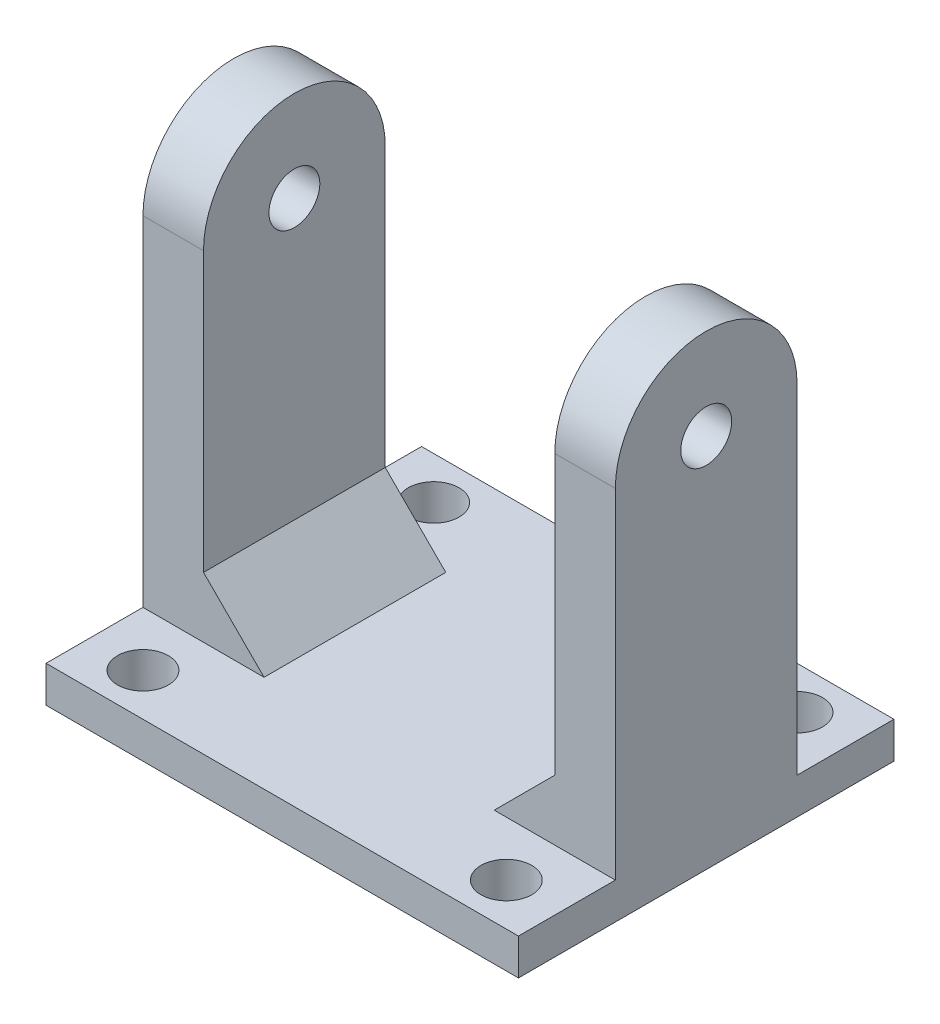
ISO-10303-21;
HEADER;
FILE_DESCRIPTION(('STEP AP214'),'2;1');
FILE_NAME('part.step','',(''),(''),'','','');
FILE_SCHEMA(('AUTOMOTIVE_DESIGN { 1 0 10303 214 1 1 1 1 }'));
ENDSEC;
DATA;
#1=APPLICATION_CONTEXT('core data for automotive mechanical design processes');
#2=APPLICATION_PROTOCOL_DEFINITION('international standard','automotive_design',2000,#1);
#3=PRODUCT_CONTEXT('',#1,'mechanical');
#4=PRODUCT('Part','Part','',(#3));
#5=PRODUCT_RELATED_PRODUCT_CATEGORY('part','',(#4));
#6=PRODUCT_DEFINITION_FORMATION('','',#4);
#7=PRODUCT_DEFINITION_CONTEXT('part definition',#1,'design');
#8=PRODUCT_DEFINITION('design','',#6,#7);
#9=PRODUCT_DEFINITION_SHAPE('','',#8);
#10=(LENGTH_UNIT() NAMED_UNIT(*) SI_UNIT(.MILLI.,.METRE.));
#11=(NAMED_UNIT(*) PLANE_ANGLE_UNIT() SI_UNIT($,.RADIAN.));
#12=(NAMED_UNIT(*) SI_UNIT($,.STERADIAN.) SOLID_ANGLE_UNIT());
#13=UNCERTAINTY_MEASURE_WITH_UNIT(LENGTH_MEASURE(1.E-05),#10,'distance_accuracy_value','');
#14=(GEOMETRIC_REPRESENTATION_CONTEXT(3) GLOBAL_UNCERTAINTY_ASSIGNED_CONTEXT((#13)) GLOBAL_UNIT_ASSIGNED_CONTEXT((#10,
#11,#12)) REPRESENTATION_CONTEXT('',''));
#15=CARTESIAN_POINT('',(0.,0.,0.));
#16=DIRECTION('',(0.,0.,1.));
#17=DIRECTION('',(1.,0.,0.));
#18=AXIS2_PLACEMENT_3D('',#15,#16,#17);
#19=CARTESIAN_POINT('',(0.,3.,0.));
#20=DIRECTION('',(0.,1.,0.));
#21=DIRECTION('',(0.,0.,1.));
#22=AXIS2_PLACEMENT_3D('',#19,#20,#21);
#23=PLANE('',#22);
#24=CARTESIAN_POINT('',(15.,3.,-12.));
#25=DIRECTION('',(0.,1.,0.));
#26=DIRECTION('',(0.,0.,1.));
#27=AXIS2_PLACEMENT_3D('',#24,#25,#26);
#28=CIRCLE('',#27,2.1);
#29=CARTESIAN_POINT('',(15.,3.,-9.9));
#30=VERTEX_POINT('',#29);
#31=EDGE_CURVE('E340',#30,#30,#28,.F.);
#32=ORIENTED_EDGE('',*,*,#31,.T.);
#33=EDGE_LOOP('',(#32));
#34=FACE_BOUND('',#33,.T.);
#35=CARTESIAN_POINT('',(15.,3.,12.));
#36=DIRECTION('',(0.,1.,0.));
#37=DIRECTION('',(0.,0.,1.));
#38=AXIS2_PLACEMENT_3D('',#35,#36,#37);
#39=CIRCLE('',#38,2.1);
#40=CARTESIAN_POINT('',(15.,3.,14.1));
#41=VERTEX_POINT('',#40);
#42=EDGE_CURVE('E331',#41,#41,#39,.F.);
#43=ORIENTED_EDGE('',*,*,#42,.T.);
#44=EDGE_LOOP('',(#43));
#45=FACE_BOUND('',#44,.T.);
#46=DIRECTION('',(-1.,0.,0.));
#47=VECTOR('',#46,1.);
#48=CARTESIAN_POINT('',(-14.5,3.,-7.49999999999999));
#49=LINE('',#48,#47);
#50=CARTESIAN_POINT('',(-9.50000000000001,3.,-7.5));
#51=VERTEX_POINT('',#50);
#52=CARTESIAN_POINT('',(-19.5,3.,-7.49999999999999));
#53=VERTEX_POINT('',#52);
#54=EDGE_CURVE('E213',#51,#53,#49,.T.);
#55=ORIENTED_EDGE('',*,*,#54,.F.);
#56=DIRECTION('',(0.,0.,1.));
#57=VECTOR('',#56,1.);
#58=CARTESIAN_POINT('',(-9.50000000000001,3.,0.));
#59=LINE('',#58,#57);
#60=CARTESIAN_POINT('',(-9.50000000000001,3.,7.5));
#61=VERTEX_POINT('',#60);
#62=EDGE_CURVE('E255',#51,#61,#59,.T.);
#63=ORIENTED_EDGE('',*,*,#62,.T.);
#64=DIRECTION('',(-1.,0.,0.));
#65=VECTOR('',#64,1.);
#66=CARTESIAN_POINT('',(-14.5,3.,7.5));
#67=LINE('',#66,#65);
#68=CARTESIAN_POINT('',(-19.5,3.,7.5));
#69=VERTEX_POINT('',#68);
#70=EDGE_CURVE('E209',#61,#69,#67,.T.);
#71=ORIENTED_EDGE('',*,*,#70,.T.);
#72=DIRECTION('',(0.,0.,1.));
#73=VECTOR('',#72,1.);
#74=CARTESIAN_POINT('',(-19.5,3.,-15.5));
#75=LINE('',#74,#73);
#76=CARTESIAN_POINT('',(-19.5,3.,15.5));
#77=VERTEX_POINT('',#76);
#78=EDGE_CURVE('E222',#69,#77,#75,.T.);
#79=ORIENTED_EDGE('',*,*,#78,.T.);
#80=DIRECTION('',(1.,0.,0.));
#81=VECTOR('',#80,1.);
#82=CARTESIAN_POINT('',(-19.5,3.,15.5));
#83=LINE('',#82,#81);
#84=CARTESIAN_POINT('',(19.5,3.,15.5));
#85=VERTEX_POINT('',#84);
#86=EDGE_CURVE('E221',#77,#85,#83,.T.);
#87=ORIENTED_EDGE('',*,*,#86,.T.);
#88=DIRECTION('',(0.,0.,-1.));
#89=VECTOR('',#88,1.);
#90=CARTESIAN_POINT('',(19.5,3.,-15.5));
#91=LINE('',#90,#89);
#92=CARTESIAN_POINT('',(19.5,3.,7.49999999999999));
#93=VERTEX_POINT('',#92);
#94=EDGE_CURVE('E225',#85,#93,#91,.T.);
#95=ORIENTED_EDGE('',*,*,#94,.T.);
#96=DIRECTION('',(1.,0.,0.));
#97=VECTOR('',#96,1.);
#98=CARTESIAN_POINT('',(14.5,3.,7.49999999999999));
#99=LINE('',#98,#97);
#100=CARTESIAN_POINT('',(9.49999999999998,3.,7.49999999999999));
#101=VERTEX_POINT('',#100);
#102=EDGE_CURVE('E157',#101,#93,#99,.T.);
#103=ORIENTED_EDGE('',*,*,#102,.F.);
#104=DIRECTION('',(0.,0.,-1.));
#105=VECTOR('',#104,1.);
#106=CARTESIAN_POINT('',(9.49999999999997,3.,0.));
#107=LINE('',#106,#105);
#108=CARTESIAN_POINT('',(9.49999999999997,3.,-7.5));
#109=VERTEX_POINT('',#108);
#110=EDGE_CURVE('E252',#101,#109,#107,.T.);
#111=ORIENTED_EDGE('',*,*,#110,.T.);
#112=DIRECTION('',(1.,0.,0.));
#113=VECTOR('',#112,1.);
#114=CARTESIAN_POINT('',(14.5,3.,-7.5));
#115=LINE('',#114,#113);
#116=CARTESIAN_POINT('',(19.5,3.,-7.5));
#117=VERTEX_POINT('',#116);
#118=EDGE_CURVE('E182',#109,#117,#115,.T.);
#119=ORIENTED_EDGE('',*,*,#118,.T.);
#120=CARTESIAN_POINT('',(19.5,3.,-15.5));
#121=VERTEX_POINT('',#120);
#122=EDGE_CURVE('E224',#117,#121,#91,.T.);
#123=ORIENTED_EDGE('',*,*,#122,.T.);
#124=DIRECTION('',(-1.,0.,0.));
#125=VECTOR('',#124,1.);
#126=CARTESIAN_POINT('',(-19.5,3.,-15.5));
#127=LINE('',#126,#125);
#128=CARTESIAN_POINT('',(-19.5,3.,-15.5));
#129=VERTEX_POINT('',#128);
#130=EDGE_CURVE('E227',#121,#129,#127,.T.);
#131=ORIENTED_EDGE('',*,*,#130,.T.);
#132=EDGE_CURVE('E218',#129,#53,#75,.T.);
#133=ORIENTED_EDGE('',*,*,#132,.T.);
#134=EDGE_LOOP('',(#55,#63,#71,#79,#87,#95,#103,#111,#119,#123,#131,#133));
#135=FACE_BOUND('',#134,.T.);
#136=CARTESIAN_POINT('',(-15.,3.,-12.));
#137=DIRECTION('',(0.,1.,0.));
#138=DIRECTION('',(0.,0.,1.));
#139=AXIS2_PLACEMENT_3D('',#136,#137,#138);
#140=CIRCLE('',#139,2.1);
#141=CARTESIAN_POINT('',(-15.,3.,-9.9));
#142=VERTEX_POINT('',#141);
#143=EDGE_CURVE('E334',#142,#142,#140,.T.);
#144=ORIENTED_EDGE('',*,*,#143,.F.);
#145=EDGE_LOOP('',(#144));
#146=FACE_BOUND('',#145,.T.);
#147=CARTESIAN_POINT('',(-15.,3.,12.));
#148=DIRECTION('',(0.,1.,0.));
#149=DIRECTION('',(0.,0.,1.));
#150=AXIS2_PLACEMENT_3D('',#147,#148,#149);
#151=CIRCLE('',#150,2.1);
#152=CARTESIAN_POINT('',(-15.,3.,14.1));
#153=VERTEX_POINT('',#152);
#154=EDGE_CURVE('E337',#153,#153,#151,.T.);
#155=ORIENTED_EDGE('',*,*,#154,.F.);
#156=EDGE_LOOP('',(#155));
#157=FACE_BOUND('',#156,.T.);
#158=ADVANCED_FACE('F45',(#34,#45,#135,#146,#157),#23,.T.);
#159=CARTESIAN_POINT('',(0.,0.,0.));
#160=DIRECTION('',(0.,1.,0.));
#161=DIRECTION('',(0.,0.,1.));
#162=AXIS2_PLACEMENT_3D('',#159,#160,#161);
#163=PLANE('',#162);
#164=CARTESIAN_POINT('',(15.,0.,-12.));
#165=DIRECTION('',(0.,-1.,0.));
#166=DIRECTION('',(0.,0.,-1.));
#167=AXIS2_PLACEMENT_3D('',#164,#165,#166);
#168=CIRCLE('',#167,2.1);
#169=CARTESIAN_POINT('',(15.,0.,-14.1));
#170=VERTEX_POINT('',#169);
#171=EDGE_CURVE('E320',#170,#170,#168,.F.);
#172=ORIENTED_EDGE('',*,*,#171,.T.);
#173=EDGE_LOOP('',(#172));
#174=FACE_BOUND('',#173,.T.);
#175=CARTESIAN_POINT('',(-15.,0.,-12.));
#176=DIRECTION('',(0.,-1.,0.));
#177=DIRECTION('',(0.,0.,-1.));
#178=AXIS2_PLACEMENT_3D('',#175,#176,#177);
#179=CIRCLE('',#178,2.1);
#180=CARTESIAN_POINT('',(-15.,0.,-14.1));
#181=VERTEX_POINT('',#180);
#182=EDGE_CURVE('E321',#181,#181,#179,.T.);
#183=ORIENTED_EDGE('',*,*,#182,.F.);
#184=EDGE_LOOP('',(#183));
#185=FACE_BOUND('',#184,.T.);
#186=CARTESIAN_POINT('',(15.,0.,12.));
#187=DIRECTION('',(0.,-1.,0.));
#188=DIRECTION('',(0.,0.,-1.));
#189=AXIS2_PLACEMENT_3D('',#186,#187,#188);
#190=CIRCLE('',#189,2.1);
#191=CARTESIAN_POINT('',(15.,0.,9.9));
#192=VERTEX_POINT('',#191);
#193=EDGE_CURVE('E324',#192,#192,#190,.F.);
#194=ORIENTED_EDGE('',*,*,#193,.T.);
#195=EDGE_LOOP('',(#194));
#196=FACE_BOUND('',#195,.T.);
#197=DIRECTION('',(0.,0.,1.));
#198=VECTOR('',#197,1.);
#199=CARTESIAN_POINT('',(-19.5,0.,-15.5));
#200=LINE('',#199,#198);
#201=CARTESIAN_POINT('',(-19.5,0.,-15.5));
#202=VERTEX_POINT('',#201);
#203=CARTESIAN_POINT('',(-19.5,0.,15.5));
#204=VERTEX_POINT('',#203);
#205=EDGE_CURVE('E212',#202,#204,#200,.T.);
#206=ORIENTED_EDGE('',*,*,#205,.F.);
#207=DIRECTION('',(-1.,0.,0.));
#208=VECTOR('',#207,1.);
#209=CARTESIAN_POINT('',(-19.5,0.,-15.5));
#210=LINE('',#209,#208);
#211=CARTESIAN_POINT('',(19.5,0.,-15.5));
#212=VERTEX_POINT('',#211);
#213=EDGE_CURVE('E236',#212,#202,#210,.T.);
#214=ORIENTED_EDGE('',*,*,#213,.F.);
#215=DIRECTION('',(0.,0.,-1.));
#216=VECTOR('',#215,1.);
#217=CARTESIAN_POINT('',(19.5,0.,-15.5));
#218=LINE('',#217,#216);
#219=CARTESIAN_POINT('',(19.5,0.,15.5));
#220=VERTEX_POINT('',#219);
#221=EDGE_CURVE('E234',#220,#212,#218,.T.);
#222=ORIENTED_EDGE('',*,*,#221,.F.);
#223=DIRECTION('',(1.,0.,0.));
#224=VECTOR('',#223,1.);
#225=CARTESIAN_POINT('',(-19.5,0.,15.5));
#226=LINE('',#225,#224);
#227=EDGE_CURVE('E232',#204,#220,#226,.T.);
#228=ORIENTED_EDGE('',*,*,#227,.F.);
#229=EDGE_LOOP('',(#206,#214,#222,#228));
#230=FACE_BOUND('',#229,.T.);
#231=CARTESIAN_POINT('',(-15.,0.,12.));
#232=DIRECTION('',(0.,-1.,0.));
#233=DIRECTION('',(0.,0.,-1.));
#234=AXIS2_PLACEMENT_3D('',#231,#232,#233);
#235=CIRCLE('',#234,2.1);
#236=CARTESIAN_POINT('',(-15.,0.,9.9));
#237=VERTEX_POINT('',#236);
#238=EDGE_CURVE('E318',#237,#237,#235,.T.);
#239=ORIENTED_EDGE('',*,*,#238,.F.);
#240=EDGE_LOOP('',(#239));
#241=FACE_BOUND('',#240,.T.);
#242=ADVANCED_FACE('F311',(#174,#185,#196,#230,#241),#163,.F.);
#243=CARTESIAN_POINT('',(-19.5,3.,-15.5));
#244=DIRECTION('',(1.,0.,0.));
#245=DIRECTION('',(0.,0.,-1.));
#246=AXIS2_PLACEMENT_3D('',#243,#244,#245);
#247=PLANE('',#246);
#248=ORIENTED_EDGE('',*,*,#205,.T.);
#249=DIRECTION('',(0.,-1.,0.));
#250=VECTOR('',#249,1.);
#251=CARTESIAN_POINT('',(-19.5,3.,15.5));
#252=LINE('',#251,#250);
#253=EDGE_CURVE('E246',#77,#204,#252,.T.);
#254=ORIENTED_EDGE('',*,*,#253,.F.);
#255=ORIENTED_EDGE('',*,*,#78,.F.);
#256=DIRECTION('',(0.,-1.,0.));
#257=VECTOR('',#256,1.);
#258=CARTESIAN_POINT('',(-19.5,0.,7.5));
#259=LINE('',#258,#257);
#260=CARTESIAN_POINT('',(-19.5,31.,7.5));
#261=VERTEX_POINT('',#260);
#262=EDGE_CURVE('E202',#261,#69,#259,.T.);
#263=ORIENTED_EDGE('',*,*,#262,.F.);
#264=CARTESIAN_POINT('',(-19.5,31.,0.));
#265=DIRECTION('',(-1.,0.,0.));
#266=DIRECTION('',(0.,0.,1.));
#267=AXIS2_PLACEMENT_3D('',#264,#265,#266);
#268=CIRCLE('',#267,7.49999999999999);
#269=CARTESIAN_POINT('',(-19.5,31.,-7.49999999999999));
#270=VERTEX_POINT('',#269);
#271=EDGE_CURVE('E204',#261,#270,#268,.T.);
#272=ORIENTED_EDGE('',*,*,#271,.T.);
#273=DIRECTION('',(0.,-1.,0.));
#274=VECTOR('',#273,1.);
#275=CARTESIAN_POINT('',(-19.5,0.,-7.5));
#276=LINE('',#275,#274);
#277=EDGE_CURVE('E190',#270,#53,#276,.T.);
#278=ORIENTED_EDGE('',*,*,#277,.T.);
#279=ORIENTED_EDGE('',*,*,#132,.F.);
#280=DIRECTION('',(0.,-1.,0.));
#281=VECTOR('',#280,1.);
#282=CARTESIAN_POINT('',(-19.5,3.,-15.5));
#283=LINE('',#282,#281);
#284=EDGE_CURVE('E229',#129,#202,#283,.T.);
#285=ORIENTED_EDGE('',*,*,#284,.T.);
#286=EDGE_LOOP('',(#248,#254,#255,#263,#272,#278,#279,#285));
#287=FACE_BOUND('',#286,.T.);
#288=CARTESIAN_POINT('',(-19.5,31.,0.));
#289=DIRECTION('',(-1.,0.,0.));
#290=DIRECTION('',(0.,0.,1.));
#291=AXIS2_PLACEMENT_3D('',#288,#289,#290);
#292=CIRCLE('',#291,2.1);
#293=CARTESIAN_POINT('',(-19.5,31.,2.09999999999999));
#294=VERTEX_POINT('',#293);
#295=EDGE_CURVE('E181',#294,#294,#292,.T.);
#296=ORIENTED_EDGE('',*,*,#295,.F.);
#297=EDGE_LOOP('',(#296));
#298=FACE_BOUND('',#297,.T.);
#299=ADVANCED_FACE('F284',(#287,#298),#247,.F.);
#300=CARTESIAN_POINT('',(-19.5,3.,15.5));
#301=DIRECTION('',(0.,0.,-1.));
#302=DIRECTION('',(-1.,0.,0.));
#303=AXIS2_PLACEMENT_3D('',#300,#301,#302);
#304=PLANE('',#303);
#305=ORIENTED_EDGE('',*,*,#227,.T.);
#306=DIRECTION('',(0.,-1.,0.));
#307=VECTOR('',#306,1.);
#308=CARTESIAN_POINT('',(19.5,3.,15.5));
#309=LINE('',#308,#307);
#310=EDGE_CURVE('E243',#85,#220,#309,.T.);
#311=ORIENTED_EDGE('',*,*,#310,.F.);
#312=ORIENTED_EDGE('',*,*,#86,.F.);
#313=ORIENTED_EDGE('',*,*,#253,.T.);
#314=EDGE_LOOP('',(#305,#311,#312,#313));
#315=FACE_BOUND('',#314,.T.);
#316=ADVANCED_FACE('F292',(#315),#304,.F.);
#317=CARTESIAN_POINT('',(19.5,3.,-15.5));
#318=DIRECTION('',(-1.,0.,0.));
#319=DIRECTION('',(0.,0.,1.));
#320=AXIS2_PLACEMENT_3D('',#317,#318,#319);
#321=PLANE('',#320);
#322=ORIENTED_EDGE('',*,*,#221,.T.);
#323=DIRECTION('',(0.,-1.,0.));
#324=VECTOR('',#323,1.);
#325=CARTESIAN_POINT('',(19.5,3.,-15.5));
#326=LINE('',#325,#324);
#327=EDGE_CURVE('E240',#121,#212,#326,.T.);
#328=ORIENTED_EDGE('',*,*,#327,.F.);
#329=ORIENTED_EDGE('',*,*,#122,.F.);
#330=DIRECTION('',(0.,1.,0.));
#331=VECTOR('',#330,1.);
#332=CARTESIAN_POINT('',(19.5,3.,-7.5));
#333=LINE('',#332,#331);
#334=CARTESIAN_POINT('',(19.5,31.,-7.5));
#335=VERTEX_POINT('',#334);
#336=EDGE_CURVE('E167',#117,#335,#333,.T.);
#337=ORIENTED_EDGE('',*,*,#336,.T.);
#338=CARTESIAN_POINT('',(19.5,31.,0.));
#339=DIRECTION('',(1.,0.,0.));
#340=DIRECTION('',(0.,0.,-1.));
#341=AXIS2_PLACEMENT_3D('',#338,#339,#340);
#342=CIRCLE('',#341,7.49999999999999);
#343=CARTESIAN_POINT('',(19.5,31.,7.49999999999999));
#344=VERTEX_POINT('',#343);
#345=EDGE_CURVE('E176',#335,#344,#342,.T.);
#346=ORIENTED_EDGE('',*,*,#345,.T.);
#347=DIRECTION('',(0.,-1.,0.));
#348=VECTOR('',#347,1.);
#349=CARTESIAN_POINT('',(19.5,31.,7.49999999999999));
#350=LINE('',#349,#348);
#351=EDGE_CURVE('E152',#344,#93,#350,.T.);
#352=ORIENTED_EDGE('',*,*,#351,.T.);
#353=ORIENTED_EDGE('',*,*,#94,.F.);
#354=ORIENTED_EDGE('',*,*,#310,.T.);
#355=EDGE_LOOP('',(#322,#328,#329,#337,#346,#352,#353,#354));
#356=FACE_BOUND('',#355,.T.);
#357=CARTESIAN_POINT('',(19.5,31.,0.));
#358=DIRECTION('',(1.,0.,0.));
#359=DIRECTION('',(0.,0.,-1.));
#360=AXIS2_PLACEMENT_3D('',#357,#358,#359);
#361=CIRCLE('',#360,2.1);
#362=CARTESIAN_POINT('',(19.5,31.,-2.10000000000001));
#363=VERTEX_POINT('',#362);
#364=EDGE_CURVE('E172',#363,#363,#361,.T.);
#365=ORIENTED_EDGE('',*,*,#364,.F.);
#366=EDGE_LOOP('',(#365));
#367=FACE_BOUND('',#366,.T.);
#368=ADVANCED_FACE('F296',(#356,#367),#321,.F.);
#369=CARTESIAN_POINT('',(-19.5,3.,-15.5));
#370=DIRECTION('',(0.,0.,1.));
#371=DIRECTION('',(1.,0.,0.));
#372=AXIS2_PLACEMENT_3D('',#369,#370,#371);
#373=PLANE('',#372);
#374=ORIENTED_EDGE('',*,*,#213,.T.);
#375=ORIENTED_EDGE('',*,*,#284,.F.);
#376=ORIENTED_EDGE('',*,*,#130,.F.);
#377=ORIENTED_EDGE('',*,*,#327,.T.);
#378=EDGE_LOOP('',(#374,#375,#376,#377));
#379=FACE_BOUND('',#378,.T.);
#380=ADVANCED_FACE('F307',(#379),#373,.F.);
#381=CARTESIAN_POINT('',(-14.5,0.,7.5));
#382=DIRECTION('',(0.,0.,-1.));
#383=DIRECTION('',(0.,1.,0.));
#384=AXIS2_PLACEMENT_3D('',#381,#382,#383);
#385=PLANE('',#384);
#386=ORIENTED_EDGE('',*,*,#262,.T.);
#387=ORIENTED_EDGE('',*,*,#70,.F.);
#388=DIRECTION('',(-0.707106781186544,0.707106781186551,0.));
#389=VECTOR('',#388,1.);
#390=CARTESIAN_POINT('',(-10.5,3.99999999999998,7.5));
#391=LINE('',#390,#389);
#392=CARTESIAN_POINT('',(-14.5,8.00000000000004,7.5));
#393=VERTEX_POINT('',#392);
#394=EDGE_CURVE('E262',#61,#393,#391,.T.);
#395=ORIENTED_EDGE('',*,*,#394,.T.);
#396=DIRECTION('',(0.,-1.,0.));
#397=VECTOR('',#396,1.);
#398=CARTESIAN_POINT('',(-14.5,0.,7.5));
#399=LINE('',#398,#397);
#400=CARTESIAN_POINT('',(-14.5,31.,7.5));
#401=VERTEX_POINT('',#400);
#402=EDGE_CURVE('E189',#401,#393,#399,.T.);
#403=ORIENTED_EDGE('',*,*,#402,.F.);
#404=DIRECTION('',(-1.,0.,0.));
#405=VECTOR('',#404,1.);
#406=CARTESIAN_POINT('',(-14.5,31.,7.5));
#407=LINE('',#406,#405);
#408=EDGE_CURVE('E199',#401,#261,#407,.T.);
#409=ORIENTED_EDGE('',*,*,#408,.T.);
#410=EDGE_LOOP('',(#386,#387,#395,#403,#409));
#411=FACE_BOUND('',#410,.T.);
#412=ADVANCED_FACE('F266',(#411),#385,.F.);
#413=CARTESIAN_POINT('',(-14.5,0.,-7.5));
#414=DIRECTION('',(0.,0.,-1.));
#415=DIRECTION('',(0.,1.,0.));
#416=AXIS2_PLACEMENT_3D('',#413,#414,#415);
#417=PLANE('',#416);
#418=ORIENTED_EDGE('',*,*,#277,.F.);
#419=DIRECTION('',(-1.,0.,0.));
#420=VECTOR('',#419,1.);
#421=CARTESIAN_POINT('',(-14.5,31.,-7.49999999999999));
#422=LINE('',#421,#420);
#423=CARTESIAN_POINT('',(-14.5,31.,-7.49999999999999));
#424=VERTEX_POINT('',#423);
#425=EDGE_CURVE('E215',#424,#270,#422,.T.);
#426=ORIENTED_EDGE('',*,*,#425,.F.);
#427=DIRECTION('',(0.,-1.,0.));
#428=VECTOR('',#427,1.);
#429=CARTESIAN_POINT('',(-14.5,0.,-7.5));
#430=LINE('',#429,#428);
#431=CARTESIAN_POINT('',(-14.5,8.00000000000004,-7.5));
#432=VERTEX_POINT('',#431);
#433=EDGE_CURVE('E196',#424,#432,#430,.T.);
#434=ORIENTED_EDGE('',*,*,#433,.T.);
#435=DIRECTION('',(0.707106781186544,-0.707106781186551,0.));
#436=VECTOR('',#435,1.);
#437=CARTESIAN_POINT('',(-14.5,8.00000000000004,-7.5));
#438=LINE('',#437,#436);
#439=EDGE_CURVE('E259',#432,#51,#438,.T.);
#440=ORIENTED_EDGE('',*,*,#439,.T.);
#441=ORIENTED_EDGE('',*,*,#54,.T.);
#442=EDGE_LOOP('',(#418,#426,#434,#440,#441));
#443=FACE_BOUND('',#442,.T.);
#444=ADVANCED_FACE('F277',(#443),#417,.T.);
#445=CARTESIAN_POINT('',(-14.5,31.,0.));
#446=DIRECTION('',(-1.,0.,0.));
#447=DIRECTION('',(0.,0.,1.));
#448=AXIS2_PLACEMENT_3D('',#445,#446,#447);
#449=CYLINDRICAL_SURFACE('',#448,2.1);
#450=CARTESIAN_POINT('',(-14.5,31.,0.));
#451=DIRECTION('',(-1.,0.,0.));
#452=DIRECTION('',(0.,0.,1.));
#453=AXIS2_PLACEMENT_3D('',#450,#451,#452);
#454=CIRCLE('',#453,2.1);
#455=CARTESIAN_POINT('',(-14.5,31.,2.09999999999999));
#456=VERTEX_POINT('',#455);
#457=EDGE_CURVE('E186',#456,#456,#454,.T.);
#458=ORIENTED_EDGE('',*,*,#457,.F.);
#459=EDGE_LOOP('',(#458));
#460=FACE_BOUND('',#459,.T.);
#461=ORIENTED_EDGE('',*,*,#295,.T.);
#462=EDGE_LOOP('',(#461));
#463=FACE_BOUND('',#462,.T.);
#464=ADVANCED_FACE('F368',(#460,#463),#449,.F.);
#465=CARTESIAN_POINT('',(-14.5,31.,0.));
#466=DIRECTION('',(-1.,0.,0.));
#467=DIRECTION('',(0.,0.,1.));
#468=AXIS2_PLACEMENT_3D('',#465,#466,#467);
#469=CYLINDRICAL_SURFACE('',#468,7.49999999999999);
#470=ORIENTED_EDGE('',*,*,#271,.F.);
#471=ORIENTED_EDGE('',*,*,#408,.F.);
#472=CARTESIAN_POINT('',(-14.5,31.,0.));
#473=DIRECTION('',(-1.,0.,0.));
#474=DIRECTION('',(0.,0.,1.));
#475=AXIS2_PLACEMENT_3D('',#472,#473,#474);
#476=CIRCLE('',#475,7.49999999999999);
#477=EDGE_CURVE('E193',#401,#424,#476,.T.);
#478=ORIENTED_EDGE('',*,*,#477,.T.);
#479=ORIENTED_EDGE('',*,*,#425,.T.);
#480=EDGE_LOOP('',(#470,#471,#478,#479));
#481=FACE_BOUND('',#480,.T.);
#482=ADVANCED_FACE('F280',(#481),#469,.T.);
#483=CARTESIAN_POINT('',(-14.5,0.,0.));
#484=DIRECTION('',(-1.,0.,0.));
#485=DIRECTION('',(0.,0.,1.));
#486=AXIS2_PLACEMENT_3D('',#483,#484,#485);
#487=PLANE('',#486);
#488=ORIENTED_EDGE('',*,*,#457,.T.);
#489=EDGE_LOOP('',(#488));
#490=FACE_BOUND('',#489,.T.);
#491=ORIENTED_EDGE('',*,*,#402,.T.);
#492=DIRECTION('',(0.,0.,-1.));
#493=VECTOR('',#492,1.);
#494=CARTESIAN_POINT('',(-14.5,8.00000000000004,0.));
#495=LINE('',#494,#493);
#496=EDGE_CURVE('E249',#393,#432,#495,.T.);
#497=ORIENTED_EDGE('',*,*,#496,.T.);
#498=ORIENTED_EDGE('',*,*,#433,.F.);
#499=ORIENTED_EDGE('',*,*,#477,.F.);
#500=EDGE_LOOP('',(#491,#497,#498,#499));
#501=FACE_BOUND('',#500,.T.);
#502=ADVANCED_FACE('F272',(#490,#501),#487,.F.);
#503=CARTESIAN_POINT('',(14.5,31.,0.));
#504=DIRECTION('',(1.,0.,0.));
#505=DIRECTION('',(0.,0.,-1.));
#506=AXIS2_PLACEMENT_3D('',#503,#504,#505);
#507=CYLINDRICAL_SURFACE('',#506,7.49999999999999);
#508=ORIENTED_EDGE('',*,*,#345,.F.);
#509=DIRECTION('',(1.,0.,0.));
#510=VECTOR('',#509,1.);
#511=CARTESIAN_POINT('',(14.5,31.,-7.5));
#512=LINE('',#511,#510);
#513=CARTESIAN_POINT('',(14.5,31.,-7.5));
#514=VERTEX_POINT('',#513);
#515=EDGE_CURVE('E166',#514,#335,#512,.T.);
#516=ORIENTED_EDGE('',*,*,#515,.F.);
#517=CARTESIAN_POINT('',(14.5,31.,0.));
#518=DIRECTION('',(1.,0.,0.));
#519=DIRECTION('',(0.,0.,-1.));
#520=AXIS2_PLACEMENT_3D('',#517,#518,#519);
#521=CIRCLE('',#520,7.49999999999999);
#522=CARTESIAN_POINT('',(14.5,31.,7.49999999999999));
#523=VERTEX_POINT('',#522);
#524=EDGE_CURVE('E162',#514,#523,#521,.T.);
#525=ORIENTED_EDGE('',*,*,#524,.T.);
#526=DIRECTION('',(1.,0.,0.));
#527=VECTOR('',#526,1.);
#528=CARTESIAN_POINT('',(14.5,31.,7.49999999999999));
#529=LINE('',#528,#527);
#530=EDGE_CURVE('E146',#523,#344,#529,.T.);
#531=ORIENTED_EDGE('',*,*,#530,.T.);
#532=EDGE_LOOP('',(#508,#516,#525,#531));
#533=FACE_BOUND('',#532,.T.);
#534=ADVANCED_FACE('F165',(#533),#507,.T.);
#535=CARTESIAN_POINT('',(14.5,3.,-7.5));
#536=DIRECTION('',(0.,0.,-1.));
#537=DIRECTION('',(-1.,0.,0.));
#538=AXIS2_PLACEMENT_3D('',#535,#536,#537);
#539=PLANE('',#538);
#540=ORIENTED_EDGE('',*,*,#336,.F.);
#541=ORIENTED_EDGE('',*,*,#118,.F.);
#542=DIRECTION('',(0.707106781186552,0.707106781186544,0.));
#543=VECTOR('',#542,1.);
#544=CARTESIAN_POINT('',(9.49999999999997,3.,-7.5));
#545=LINE('',#544,#543);
#546=CARTESIAN_POINT('',(14.5,7.99999999999998,-7.5));
#547=VERTEX_POINT('',#546);
#548=EDGE_CURVE('E54',#109,#547,#545,.T.);
#549=ORIENTED_EDGE('',*,*,#548,.T.);
#550=DIRECTION('',(0.,1.,0.));
#551=VECTOR('',#550,1.);
#552=CARTESIAN_POINT('',(14.5,3.,-7.5));
#553=LINE('',#552,#551);
#554=EDGE_CURVE('E158',#547,#514,#553,.T.);
#555=ORIENTED_EDGE('',*,*,#554,.T.);
#556=ORIENTED_EDGE('',*,*,#515,.T.);
#557=EDGE_LOOP('',(#540,#541,#549,#555,#556));
#558=FACE_BOUND('',#557,.T.);
#559=ADVANCED_FACE('F302',(#558),#539,.T.);
#560=CARTESIAN_POINT('',(14.5,31.,7.49999999999999));
#561=DIRECTION('',(0.,0.,1.));
#562=DIRECTION('',(1.,0.,0.));
#563=AXIS2_PLACEMENT_3D('',#560,#561,#562);
#564=PLANE('',#563);
#565=ORIENTED_EDGE('',*,*,#351,.F.);
#566=ORIENTED_EDGE('',*,*,#530,.F.);
#567=DIRECTION('',(0.,-1.,0.));
#568=VECTOR('',#567,1.);
#569=CARTESIAN_POINT('',(14.5,31.,7.49999999999999));
#570=LINE('',#569,#568);
#571=CARTESIAN_POINT('',(14.5,7.99999999999998,7.49999999999999));
#572=VERTEX_POINT('',#571);
#573=EDGE_CURVE('E148',#523,#572,#570,.T.);
#574=ORIENTED_EDGE('',*,*,#573,.T.);
#575=DIRECTION('',(-0.707106781186552,-0.707106781186544,0.));
#576=VECTOR('',#575,1.);
#577=CARTESIAN_POINT('',(9.49999999999998,3.,7.49999999999999));
#578=LINE('',#577,#576);
#579=EDGE_CURVE('E11',#572,#101,#578,.T.);
#580=ORIENTED_EDGE('',*,*,#579,.T.);
#581=ORIENTED_EDGE('',*,*,#102,.T.);
#582=EDGE_LOOP('',(#565,#566,#574,#580,#581));
#583=FACE_BOUND('',#582,.T.);
#584=ADVANCED_FACE('F147',(#583),#564,.T.);
#585=CARTESIAN_POINT('',(14.5,31.,0.));
#586=DIRECTION('',(1.,0.,0.));
#587=DIRECTION('',(0.,0.,-1.));
#588=AXIS2_PLACEMENT_3D('',#585,#586,#587);
#589=PLANE('',#588);
#590=CARTESIAN_POINT('',(14.5,31.,0.));
#591=DIRECTION('',(1.,0.,0.));
#592=DIRECTION('',(0.,0.,-1.));
#593=AXIS2_PLACEMENT_3D('',#590,#591,#592);
#594=CIRCLE('',#593,2.1);
#595=CARTESIAN_POINT('',(14.5,31.,-2.10000000000001));
#596=VERTEX_POINT('',#595);
#597=EDGE_CURVE('E178',#596,#596,#594,.T.);
#598=ORIENTED_EDGE('',*,*,#597,.T.);
#599=EDGE_LOOP('',(#598));
#600=FACE_BOUND('',#599,.T.);
#601=ORIENTED_EDGE('',*,*,#554,.F.);
#602=DIRECTION('',(0.,0.,1.));
#603=VECTOR('',#602,1.);
#604=CARTESIAN_POINT('',(14.5,7.99999999999998,0.));
#605=LINE('',#604,#603);
#606=EDGE_CURVE('E61',#547,#572,#605,.T.);
#607=ORIENTED_EDGE('',*,*,#606,.T.);
#608=ORIENTED_EDGE('',*,*,#573,.F.);
#609=ORIENTED_EDGE('',*,*,#524,.F.);
#610=EDGE_LOOP('',(#601,#607,#608,#609));
#611=FACE_BOUND('',#610,.T.);
#612=ADVANCED_FACE('F161',(#600,#611),#589,.F.);
#613=CARTESIAN_POINT('',(14.5,31.,0.));
#614=DIRECTION('',(1.,0.,0.));
#615=DIRECTION('',(0.,0.,-1.));
#616=AXIS2_PLACEMENT_3D('',#613,#614,#615);
#617=CYLINDRICAL_SURFACE('',#616,2.1);
#618=ORIENTED_EDGE('',*,*,#597,.F.);
#619=EDGE_LOOP('',(#618));
#620=FACE_BOUND('',#619,.T.);
#621=ORIENTED_EDGE('',*,*,#364,.T.);
#622=EDGE_LOOP('',(#621));
#623=FACE_BOUND('',#622,.T.);
#624=ADVANCED_FACE('F348',(#620,#623),#617,.F.);
#625=CARTESIAN_POINT('',(15.,38.5,12.));
#626=DIRECTION('',(0.,-1.,0.));
#627=DIRECTION('',(0.,0.,-1.));
#628=AXIS2_PLACEMENT_3D('',#625,#626,#627);
#629=CYLINDRICAL_SURFACE('',#628,2.1);
#630=ORIENTED_EDGE('',*,*,#42,.F.);
#631=EDGE_LOOP('',(#630));
#632=FACE_BOUND('',#631,.T.);
#633=ORIENTED_EDGE('',*,*,#193,.F.);
#634=EDGE_LOOP('',(#633));
#635=FACE_BOUND('',#634,.T.);
#636=ADVANCED_FACE('F388',(#632,#635),#629,.F.);
#637=CARTESIAN_POINT('',(-15.,38.5,-12.));
#638=DIRECTION('',(0.,-1.,0.));
#639=DIRECTION('',(0.,0.,-1.));
#640=AXIS2_PLACEMENT_3D('',#637,#638,#639);
#641=CYLINDRICAL_SURFACE('',#640,2.1);
#642=ORIENTED_EDGE('',*,*,#143,.T.);
#643=EDGE_LOOP('',(#642));
#644=FACE_BOUND('',#643,.T.);
#645=ORIENTED_EDGE('',*,*,#182,.T.);
#646=EDGE_LOOP('',(#645));
#647=FACE_BOUND('',#646,.T.);
#648=ADVANCED_FACE('F392',(#644,#647),#641,.F.);
#649=CARTESIAN_POINT('',(-15.,38.5,12.));
#650=DIRECTION('',(0.,-1.,0.));
#651=DIRECTION('',(0.,0.,-1.));
#652=AXIS2_PLACEMENT_3D('',#649,#650,#651);
#653=CYLINDRICAL_SURFACE('',#652,2.1);
#654=ORIENTED_EDGE('',*,*,#154,.T.);
#655=EDGE_LOOP('',(#654));
#656=FACE_BOUND('',#655,.T.);
#657=ORIENTED_EDGE('',*,*,#238,.T.);
#658=EDGE_LOOP('',(#657));
#659=FACE_BOUND('',#658,.T.);
#660=ADVANCED_FACE('F394',(#656,#659),#653,.F.);
#661=CARTESIAN_POINT('',(15.,38.5,-12.));
#662=DIRECTION('',(0.,-1.,0.));
#663=DIRECTION('',(0.,0.,-1.));
#664=AXIS2_PLACEMENT_3D('',#661,#662,#663);
#665=CYLINDRICAL_SURFACE('',#664,2.1);
#666=ORIENTED_EDGE('',*,*,#31,.F.);
#667=EDGE_LOOP('',(#666));
#668=FACE_BOUND('',#667,.T.);
#669=ORIENTED_EDGE('',*,*,#171,.F.);
#670=EDGE_LOOP('',(#669));
#671=FACE_BOUND('',#670,.T.);
#672=ADVANCED_FACE('F397',(#668,#671),#665,.F.);
#673=CARTESIAN_POINT('',(-14.5,8.00000000000004,0.));
#674=DIRECTION('',(-0.707106781186551,-0.707106781186544,0.));
#675=DIRECTION('',(0.,0.,-1.));
#676=AXIS2_PLACEMENT_3D('',#673,#674,#675);
#677=PLANE('',#676);
#678=ORIENTED_EDGE('',*,*,#394,.F.);
#679=ORIENTED_EDGE('',*,*,#62,.F.);
#680=ORIENTED_EDGE('',*,*,#439,.F.);
#681=ORIENTED_EDGE('',*,*,#496,.F.);
#682=EDGE_LOOP('',(#678,#679,#680,#681));
#683=FACE_BOUND('',#682,.T.);
#684=ADVANCED_FACE('F274',(#683),#677,.F.);
#685=CARTESIAN_POINT('',(9.49999999999997,3.,0.));
#686=DIRECTION('',(0.707106781186544,-0.707106781186552,0.));
#687=DIRECTION('',(0.,0.,-1.));
#688=AXIS2_PLACEMENT_3D('',#685,#686,#687);
#689=PLANE('',#688);
#690=ORIENTED_EDGE('',*,*,#579,.F.);
#691=ORIENTED_EDGE('',*,*,#606,.F.);
#692=ORIENTED_EDGE('',*,*,#548,.F.);
#693=ORIENTED_EDGE('',*,*,#110,.F.);
#694=EDGE_LOOP('',(#690,#691,#692,#693));
#695=FACE_BOUND('',#694,.T.);
#696=ADVANCED_FACE('F48',(#695),#689,.F.);
#697=CLOSED_SHELL('',(#158,#242,#299,#316,#368,#380,#412,#444,#464,#482,#502,#534,#559,#584,
#612,#624,#636,#648,#660,#672,#684,#696));
#698=MANIFOLD_SOLID_BREP('B2',#697);
#699=ADVANCED_BREP_SHAPE_REPRESENTATION('',(#18,#698),#14);
#700=SHAPE_DEFINITION_REPRESENTATION(#9,#699);
ENDSEC;
END-ISO-10303-21;
